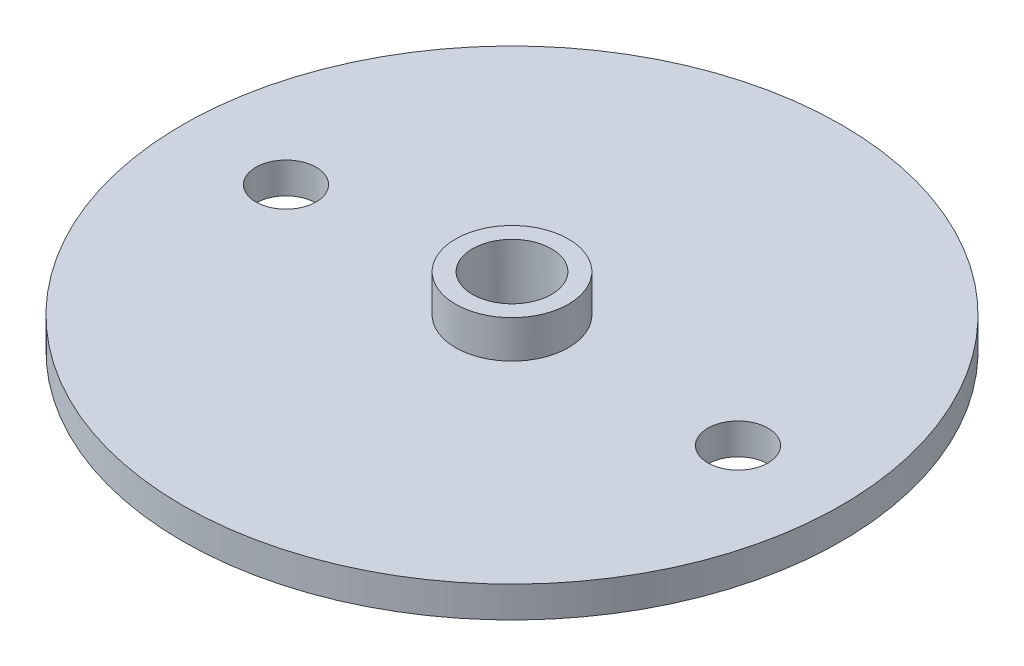
ISO-10303-21;
HEADER;
FILE_DESCRIPTION(('STEP AP214'),'2;1');
FILE_NAME('part.step','',(''),(''),'','','');
FILE_SCHEMA(('AUTOMOTIVE_DESIGN { 1 0 10303 214 1 1 1 1 }'));
ENDSEC;
DATA;
#1=APPLICATION_CONTEXT('core data for automotive mechanical design processes');
#2=APPLICATION_PROTOCOL_DEFINITION('international standard','automotive_design',2000,#1);
#3=PRODUCT_CONTEXT('',#1,'mechanical');
#4=PRODUCT('Part','Part','',(#3));
#5=PRODUCT_RELATED_PRODUCT_CATEGORY('part','',(#4));
#6=PRODUCT_DEFINITION_FORMATION('','',#4);
#7=PRODUCT_DEFINITION_CONTEXT('part definition',#1,'design');
#8=PRODUCT_DEFINITION('design','',#6,#7);
#9=PRODUCT_DEFINITION_SHAPE('','',#8);
#10=(LENGTH_UNIT() NAMED_UNIT(*) SI_UNIT(.MILLI.,.METRE.));
#11=(NAMED_UNIT(*) PLANE_ANGLE_UNIT() SI_UNIT($,.RADIAN.));
#12=(NAMED_UNIT(*) SI_UNIT($,.STERADIAN.) SOLID_ANGLE_UNIT());
#13=UNCERTAINTY_MEASURE_WITH_UNIT(LENGTH_MEASURE(1.E-05),#10,'distance_accuracy_value','');
#14=(GEOMETRIC_REPRESENTATION_CONTEXT(3) GLOBAL_UNCERTAINTY_ASSIGNED_CONTEXT((#13)) GLOBAL_UNIT_ASSIGNED_CONTEXT((#10,
#11,#12)) REPRESENTATION_CONTEXT('',''));
#15=CARTESIAN_POINT('',(0.,0.,0.));
#16=DIRECTION('',(0.,0.,1.));
#17=DIRECTION('',(1.,0.,0.));
#18=AXIS2_PLACEMENT_3D('',#15,#16,#17);
#19=CARTESIAN_POINT('',(0.,3.,0.));
#20=DIRECTION('',(0.,-1.,0.));
#21=DIRECTION('',(0.,0.,1.));
#22=AXIS2_PLACEMENT_3D('',#19,#20,#21);
#23=CYLINDRICAL_SURFACE('',#22,3.);
#24=CARTESIAN_POINT('',(0.,3.,0.));
#25=DIRECTION('',(0.,-1.,0.));
#26=DIRECTION('',(0.,0.,-1.));
#27=AXIS2_PLACEMENT_3D('',#24,#25,#26);
#28=CIRCLE('',#27,3.);
#29=CARTESIAN_POINT('',(0.,3.,-3.));
#30=VERTEX_POINT('',#29);
#31=EDGE_CURVE('E38',#30,#30,#28,.T.);
#32=ORIENTED_EDGE('',*,*,#31,.T.);
#33=EDGE_LOOP('',(#32));
#34=FACE_BOUND('',#33,.T.);
#35=CARTESIAN_POINT('',(0.,1.,0.));
#36=DIRECTION('',(0.,1.,0.));
#37=DIRECTION('',(0.,0.,1.));
#38=AXIS2_PLACEMENT_3D('',#35,#36,#37);
#39=CIRCLE('',#38,3.);
#40=CARTESIAN_POINT('',(0.,1.,3.));
#41=VERTEX_POINT('',#40);
#42=EDGE_CURVE('E10',#41,#41,#39,.T.);
#43=ORIENTED_EDGE('',*,*,#42,.T.);
#44=EDGE_LOOP('',(#43));
#45=FACE_BOUND('',#44,.T.);
#46=ADVANCED_FACE('F35',(#34,#45),#23,.T.);
#47=CARTESIAN_POINT('',(0.,3.,0.));
#48=DIRECTION('',(0.,1.,0.));
#49=DIRECTION('',(0.,0.,-1.));
#50=AXIS2_PLACEMENT_3D('',#47,#48,#49);
#51=PLANE('',#50);
#52=ORIENTED_EDGE('',*,*,#31,.F.);
#53=EDGE_LOOP('',(#52));
#54=FACE_BOUND('',#53,.T.);
#55=CARTESIAN_POINT('',(0.,3.,0.));
#56=DIRECTION('',(0.,-1.,0.));
#57=DIRECTION('',(0.,0.,-1.));
#58=AXIS2_PLACEMENT_3D('',#55,#56,#57);
#59=CIRCLE('',#58,2.1);
#60=CARTESIAN_POINT('',(0.,3.,-2.1));
#61=VERTEX_POINT('',#60);
#62=EDGE_CURVE('E46',#61,#61,#59,.T.);
#63=ORIENTED_EDGE('',*,*,#62,.T.);
#64=EDGE_LOOP('',(#63));
#65=FACE_BOUND('',#64,.T.);
#66=ADVANCED_FACE('F94',(#54,#65),#51,.T.);
#67=CARTESIAN_POINT('',(0.,3.,0.));
#68=DIRECTION('',(0.,-1.,0.));
#69=DIRECTION('',(0.,0.,1.));
#70=AXIS2_PLACEMENT_3D('',#67,#68,#69);
#71=CYLINDRICAL_SURFACE('',#70,2.1);
#72=ORIENTED_EDGE('',*,*,#62,.F.);
#73=EDGE_LOOP('',(#72));
#74=FACE_BOUND('',#73,.T.);
#75=CARTESIAN_POINT('',(0.,-0.65,0.));
#76=DIRECTION('',(0.,1.,0.));
#77=DIRECTION('',(0.,0.,1.));
#78=AXIS2_PLACEMENT_3D('',#75,#76,#77);
#79=CIRCLE('',#78,2.1);
#80=CARTESIAN_POINT('',(0.,-0.65,2.1));
#81=VERTEX_POINT('',#80);
#82=EDGE_CURVE('E58',#81,#81,#79,.T.);
#83=ORIENTED_EDGE('',*,*,#82,.F.);
#84=EDGE_LOOP('',(#83));
#85=FACE_BOUND('',#84,.T.);
#86=ADVANCED_FACE('F91',(#74,#85),#71,.F.);
#87=CARTESIAN_POINT('',(0.,1.,0.));
#88=DIRECTION('',(0.,-1.,0.));
#89=DIRECTION('',(0.,0.,1.));
#90=AXIS2_PLACEMENT_3D('',#87,#88,#89);
#91=PLANE('',#90);
#92=CARTESIAN_POINT('',(-12.,1.,0.));
#93=DIRECTION('',(0.,-1.,0.));
#94=DIRECTION('',(0.,0.,-1.));
#95=AXIS2_PLACEMENT_3D('',#92,#93,#94);
#96=CIRCLE('',#95,1.6);
#97=CARTESIAN_POINT('',(-12.,1.,-1.6));
#98=VERTEX_POINT('',#97);
#99=EDGE_CURVE('E71',#98,#98,#96,.T.);
#100=ORIENTED_EDGE('',*,*,#99,.T.);
#101=EDGE_LOOP('',(#100));
#102=FACE_BOUND('',#101,.T.);
#103=CARTESIAN_POINT('',(12.,1.,0.));
#104=DIRECTION('',(0.,-1.,0.));
#105=DIRECTION('',(0.,0.,1.));
#106=AXIS2_PLACEMENT_3D('',#103,#104,#105);
#107=CIRCLE('',#106,1.6);
#108=CARTESIAN_POINT('',(12.,1.,1.6));
#109=VERTEX_POINT('',#108);
#110=EDGE_CURVE('E65',#109,#109,#107,.T.);
#111=ORIENTED_EDGE('',*,*,#110,.T.);
#112=EDGE_LOOP('',(#111));
#113=FACE_BOUND('',#112,.T.);
#114=CARTESIAN_POINT('',(0.,1.,0.));
#115=DIRECTION('',(0.,1.,0.));
#116=DIRECTION('',(0.,0.,1.));
#117=AXIS2_PLACEMENT_3D('',#114,#115,#116);
#118=CIRCLE('',#117,17.5);
#119=CARTESIAN_POINT('',(0.,1.,17.5));
#120=VERTEX_POINT('',#119);
#121=EDGE_CURVE('E48',#120,#120,#118,.T.);
#122=ORIENTED_EDGE('',*,*,#121,.T.);
#123=EDGE_LOOP('',(#122));
#124=FACE_BOUND('',#123,.T.);
#125=ORIENTED_EDGE('',*,*,#42,.F.);
#126=EDGE_LOOP('',(#125));
#127=FACE_BOUND('',#126,.T.);
#128=ADVANCED_FACE('F93',(#102,#113,#124,#127),#91,.F.);
#129=CARTESIAN_POINT('',(0.,1.,0.));
#130=DIRECTION('',(0.,-1.,0.));
#131=DIRECTION('',(0.,0.,1.));
#132=AXIS2_PLACEMENT_3D('',#129,#130,#131);
#133=CYLINDRICAL_SURFACE('',#132,17.5);
#134=ORIENTED_EDGE('',*,*,#121,.F.);
#135=EDGE_LOOP('',(#134));
#136=FACE_BOUND('',#135,.T.);
#137=CARTESIAN_POINT('',(0.,-0.65,0.));
#138=DIRECTION('',(0.,1.,0.));
#139=DIRECTION('',(0.,0.,1.));
#140=AXIS2_PLACEMENT_3D('',#137,#138,#139);
#141=CIRCLE('',#140,17.5);
#142=CARTESIAN_POINT('',(0.,-0.65,17.5));
#143=VERTEX_POINT('',#142);
#144=EDGE_CURVE('E54',#143,#143,#141,.T.);
#145=ORIENTED_EDGE('',*,*,#144,.T.);
#146=EDGE_LOOP('',(#145));
#147=FACE_BOUND('',#146,.T.);
#148=ADVANCED_FACE('F84',(#136,#147),#133,.T.);
#149=CARTESIAN_POINT('',(0.,-0.65,0.));
#150=DIRECTION('',(0.,-1.,0.));
#151=DIRECTION('',(0.,0.,1.));
#152=AXIS2_PLACEMENT_3D('',#149,#150,#151);
#153=PLANE('',#152);
#154=CARTESIAN_POINT('',(-12.,-0.65,0.));
#155=DIRECTION('',(0.,-1.,0.));
#156=DIRECTION('',(0.,0.,-1.));
#157=AXIS2_PLACEMENT_3D('',#154,#155,#156);
#158=CIRCLE('',#157,1.6);
#159=CARTESIAN_POINT('',(-12.,-0.65,-1.6));
#160=VERTEX_POINT('',#159);
#161=EDGE_CURVE('E62',#160,#160,#158,.T.);
#162=ORIENTED_EDGE('',*,*,#161,.F.);
#163=EDGE_LOOP('',(#162));
#164=FACE_BOUND('',#163,.T.);
#165=CARTESIAN_POINT('',(12.,-0.65,0.));
#166=DIRECTION('',(0.,-1.,0.));
#167=DIRECTION('',(0.,0.,1.));
#168=AXIS2_PLACEMENT_3D('',#165,#166,#167);
#169=CIRCLE('',#168,1.6);
#170=CARTESIAN_POINT('',(12.,-0.65,1.6));
#171=VERTEX_POINT('',#170);
#172=EDGE_CURVE('E68',#171,#171,#169,.T.);
#173=ORIENTED_EDGE('',*,*,#172,.F.);
#174=EDGE_LOOP('',(#173));
#175=FACE_BOUND('',#174,.T.);
#176=ORIENTED_EDGE('',*,*,#144,.F.);
#177=EDGE_LOOP('',(#176));
#178=FACE_BOUND('',#177,.T.);
#179=ORIENTED_EDGE('',*,*,#82,.T.);
#180=EDGE_LOOP('',(#179));
#181=FACE_BOUND('',#180,.T.);
#182=ADVANCED_FACE('F80',(#164,#175,#178,#181),#153,.T.);
#183=CARTESIAN_POINT('',(12.,-0.65,0.));
#184=DIRECTION('',(0.,1.,0.));
#185=DIRECTION('',(0.,0.,-1.));
#186=AXIS2_PLACEMENT_3D('',#183,#184,#185);
#187=CYLINDRICAL_SURFACE('',#186,1.6);
#188=ORIENTED_EDGE('',*,*,#172,.T.);
#189=EDGE_LOOP('',(#188));
#190=FACE_BOUND('',#189,.T.);
#191=ORIENTED_EDGE('',*,*,#110,.F.);
#192=EDGE_LOOP('',(#191));
#193=FACE_BOUND('',#192,.T.);
#194=ADVANCED_FACE('F83',(#190,#193),#187,.F.);
#195=CARTESIAN_POINT('',(-12.,-0.65,0.));
#196=DIRECTION('',(0.,1.,0.));
#197=DIRECTION('',(0.,0.,-1.));
#198=AXIS2_PLACEMENT_3D('',#195,#196,#197);
#199=CYLINDRICAL_SURFACE('',#198,1.6);
#200=ORIENTED_EDGE('',*,*,#161,.T.);
#201=EDGE_LOOP('',(#200));
#202=FACE_BOUND('',#201,.T.);
#203=ORIENTED_EDGE('',*,*,#99,.F.);
#204=EDGE_LOOP('',(#203));
#205=FACE_BOUND('',#204,.T.);
#206=ADVANCED_FACE('F77',(#202,#205),#199,.F.);
#207=CLOSED_SHELL('',(#46,#66,#86,#128,#148,#182,#194,#206));
#208=MANIFOLD_SOLID_BREP('B2',#207);
#209=ADVANCED_BREP_SHAPE_REPRESENTATION('',(#18,#208),#14);
#210=SHAPE_DEFINITION_REPRESENTATION(#9,#209);
ENDSEC;
END-ISO-10303-21;
